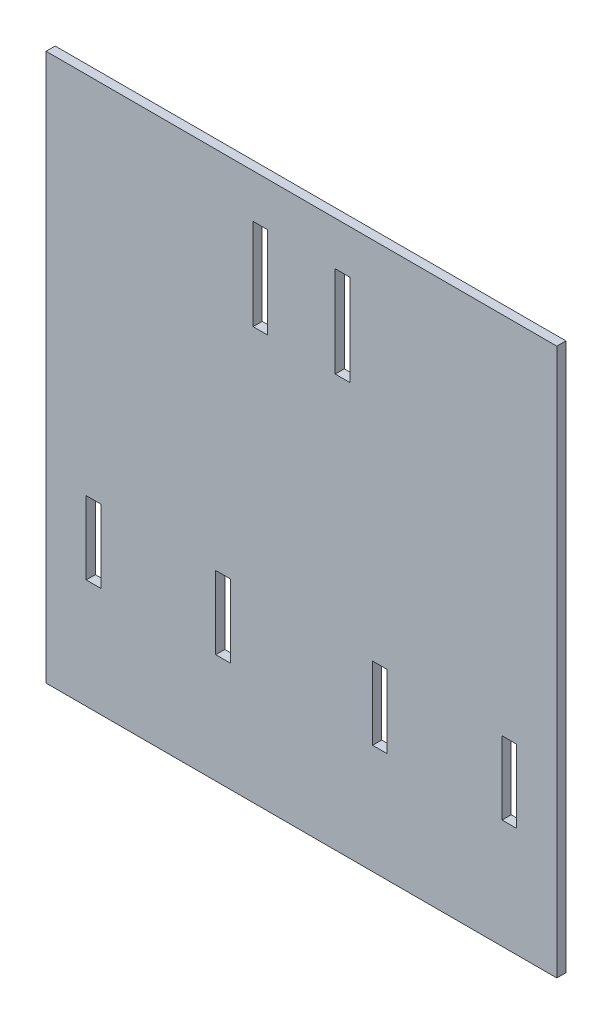
ISO-10303-21;
HEADER;
FILE_DESCRIPTION(('STEP AP214'),'2;1');
FILE_NAME('part.step','',(''),(''),'','','');
FILE_SCHEMA(('AUTOMOTIVE_DESIGN { 1 0 10303 214 1 1 1 1 }'));
ENDSEC;
DATA;
#1=APPLICATION_CONTEXT('core data for automotive mechanical design processes');
#2=APPLICATION_PROTOCOL_DEFINITION('international standard','automotive_design',2000,#1);
#3=PRODUCT_CONTEXT('',#1,'mechanical');
#4=PRODUCT('Part','Part','',(#3));
#5=PRODUCT_RELATED_PRODUCT_CATEGORY('part','',(#4));
#6=PRODUCT_DEFINITION_FORMATION('','',#4);
#7=PRODUCT_DEFINITION_CONTEXT('part definition',#1,'design');
#8=PRODUCT_DEFINITION('design','',#6,#7);
#9=PRODUCT_DEFINITION_SHAPE('','',#8);
#10=(LENGTH_UNIT() NAMED_UNIT(*) SI_UNIT(.MILLI.,.METRE.));
#11=(NAMED_UNIT(*) PLANE_ANGLE_UNIT() SI_UNIT($,.RADIAN.));
#12=(NAMED_UNIT(*) SI_UNIT($,.STERADIAN.) SOLID_ANGLE_UNIT());
#13=UNCERTAINTY_MEASURE_WITH_UNIT(LENGTH_MEASURE(1.E-05),#10,'distance_accuracy_value','');
#14=(GEOMETRIC_REPRESENTATION_CONTEXT(3) GLOBAL_UNCERTAINTY_ASSIGNED_CONTEXT((#13)) GLOBAL_UNIT_ASSIGNED_CONTEXT((#10,
#11,#12)) REPRESENTATION_CONTEXT('',''));
#15=CARTESIAN_POINT('',(0.,0.,0.));
#16=DIRECTION('',(0.,0.,1.));
#17=DIRECTION('',(1.,0.,0.));
#18=AXIS2_PLACEMENT_3D('',#15,#16,#17);
#19=CARTESIAN_POINT('',(-140.,0.,5.));
#20=DIRECTION('',(1.,0.,0.));
#21=DIRECTION('',(0.,0.,-1.));
#22=AXIS2_PLACEMENT_3D('',#19,#20,#21);
#23=PLANE('',#22);
#24=DIRECTION('',(0.,-1.,0.));
#25=VECTOR('',#24,1.);
#26=CARTESIAN_POINT('',(-140.,0.,0.));
#27=LINE('',#26,#25);
#28=CARTESIAN_POINT('',(-140.,300.,0.));
#29=VERTEX_POINT('',#28);
#30=CARTESIAN_POINT('',(-140.,0.,0.));
#31=VERTEX_POINT('',#30);
#32=EDGE_CURVE('E272',#29,#31,#27,.T.);
#33=ORIENTED_EDGE('',*,*,#32,.T.);
#34=DIRECTION('',(0.,0.,-1.));
#35=VECTOR('',#34,1.);
#36=CARTESIAN_POINT('',(-140.,0.,5.));
#37=LINE('',#36,#35);
#38=CARTESIAN_POINT('',(-140.,0.,5.));
#39=VERTEX_POINT('',#38);
#40=EDGE_CURVE('E11',#39,#31,#37,.T.);
#41=ORIENTED_EDGE('',*,*,#40,.F.);
#42=DIRECTION('',(0.,-1.,0.));
#43=VECTOR('',#42,1.);
#44=CARTESIAN_POINT('',(-140.,0.,5.));
#45=LINE('',#44,#43);
#46=CARTESIAN_POINT('',(-140.,300.,5.));
#47=VERTEX_POINT('',#46);
#48=EDGE_CURVE('E495',#47,#39,#45,.T.);
#49=ORIENTED_EDGE('',*,*,#48,.F.);
#50=DIRECTION('',(0.,0.,-1.));
#51=VECTOR('',#50,1.);
#52=CARTESIAN_POINT('',(-140.,300.,5.));
#53=LINE('',#52,#51);
#54=EDGE_CURVE('E509',#47,#29,#53,.T.);
#55=ORIENTED_EDGE('',*,*,#54,.T.);
#56=EDGE_LOOP('',(#33,#41,#49,#55));
#57=FACE_BOUND('',#56,.T.);
#58=ADVANCED_FACE('F39',(#57),#23,.F.);
#59=CARTESIAN_POINT('',(-140.,0.,5.));
#60=DIRECTION('',(0.,1.,0.));
#61=DIRECTION('',(0.,0.,1.));
#62=AXIS2_PLACEMENT_3D('',#59,#60,#61);
#63=PLANE('',#62);
#64=DIRECTION('',(1.,0.,0.));
#65=VECTOR('',#64,1.);
#66=CARTESIAN_POINT('',(-140.,0.,0.));
#67=LINE('',#66,#65);
#68=CARTESIAN_POINT('',(140.,0.,0.));
#69=VERTEX_POINT('',#68);
#70=EDGE_CURVE('E513',#31,#69,#67,.T.);
#71=ORIENTED_EDGE('',*,*,#70,.T.);
#72=DIRECTION('',(0.,0.,-1.));
#73=VECTOR('',#72,1.);
#74=CARTESIAN_POINT('',(140.,0.,5.));
#75=LINE('',#74,#73);
#76=CARTESIAN_POINT('',(140.,0.,5.));
#77=VERTEX_POINT('',#76);
#78=EDGE_CURVE('E47',#77,#69,#75,.T.);
#79=ORIENTED_EDGE('',*,*,#78,.F.);
#80=DIRECTION('',(1.,0.,0.));
#81=VECTOR('',#80,1.);
#82=CARTESIAN_POINT('',(-140.,0.,5.));
#83=LINE('',#82,#81);
#84=EDGE_CURVE('E499',#39,#77,#83,.T.);
#85=ORIENTED_EDGE('',*,*,#84,.F.);
#86=ORIENTED_EDGE('',*,*,#40,.T.);
#87=EDGE_LOOP('',(#71,#79,#85,#86));
#88=FACE_BOUND('',#87,.T.);
#89=ADVANCED_FACE('F548',(#88),#63,.F.);
#90=CARTESIAN_POINT('',(140.,0.,5.));
#91=DIRECTION('',(-1.,0.,0.));
#92=DIRECTION('',(0.,0.,1.));
#93=AXIS2_PLACEMENT_3D('',#90,#91,#92);
#94=PLANE('',#93);
#95=DIRECTION('',(0.,1.,0.));
#96=VECTOR('',#95,1.);
#97=CARTESIAN_POINT('',(140.,0.,0.));
#98=LINE('',#97,#96);
#99=CARTESIAN_POINT('',(140.,300.,0.));
#100=VERTEX_POINT('',#99);
#101=EDGE_CURVE('E516',#69,#100,#98,.T.);
#102=ORIENTED_EDGE('',*,*,#101,.T.);
#103=DIRECTION('',(0.,0.,-1.));
#104=VECTOR('',#103,1.);
#105=CARTESIAN_POINT('',(140.,300.,5.));
#106=LINE('',#105,#104);
#107=CARTESIAN_POINT('',(140.,300.,5.));
#108=VERTEX_POINT('',#107);
#109=EDGE_CURVE('E524',#108,#100,#106,.T.);
#110=ORIENTED_EDGE('',*,*,#109,.F.);
#111=DIRECTION('',(0.,1.,0.));
#112=VECTOR('',#111,1.);
#113=CARTESIAN_POINT('',(140.,0.,5.));
#114=LINE('',#113,#112);
#115=EDGE_CURVE('E503',#77,#108,#114,.T.);
#116=ORIENTED_EDGE('',*,*,#115,.F.);
#117=ORIENTED_EDGE('',*,*,#78,.T.);
#118=EDGE_LOOP('',(#102,#110,#116,#117));
#119=FACE_BOUND('',#118,.T.);
#120=ADVANCED_FACE('F533',(#119),#94,.F.);
#121=CARTESIAN_POINT('',(-140.,300.,5.));
#122=DIRECTION('',(0.,-1.,0.));
#123=DIRECTION('',(0.,0.,-1.));
#124=AXIS2_PLACEMENT_3D('',#121,#122,#123);
#125=PLANE('',#124);
#126=DIRECTION('',(-1.,0.,0.));
#127=VECTOR('',#126,1.);
#128=CARTESIAN_POINT('',(-140.,300.,0.));
#129=LINE('',#128,#127);
#130=EDGE_CURVE('E500',#100,#29,#129,.T.);
#131=ORIENTED_EDGE('',*,*,#130,.T.);
#132=ORIENTED_EDGE('',*,*,#54,.F.);
#133=DIRECTION('',(-1.,0.,0.));
#134=VECTOR('',#133,1.);
#135=CARTESIAN_POINT('',(-140.,300.,5.));
#136=LINE('',#135,#134);
#137=EDGE_CURVE('E506',#108,#47,#136,.T.);
#138=ORIENTED_EDGE('',*,*,#137,.F.);
#139=ORIENTED_EDGE('',*,*,#109,.T.);
#140=EDGE_LOOP('',(#131,#132,#138,#139));
#141=FACE_BOUND('',#140,.T.);
#142=ADVANCED_FACE('F542',(#141),#125,.F.);
#143=CARTESIAN_POINT('',(0.,0.,5.));
#144=DIRECTION('',(0.,0.,-1.));
#145=DIRECTION('',(-1.,0.,0.));
#146=AXIS2_PLACEMENT_3D('',#143,#144,#145);
#147=PLANE('',#146);
#148=DIRECTION('',(1.,0.,0.));
#149=VECTOR('',#148,1.);
#150=CARTESIAN_POINT('',(118.,100.,5.));
#151=LINE('',#150,#149);
#152=CARTESIAN_POINT('',(110.,100.,5.));
#153=VERTEX_POINT('',#152);
#154=CARTESIAN_POINT('',(118.,100.,5.));
#155=VERTEX_POINT('',#154);
#156=EDGE_CURVE('E237',#153,#155,#151,.T.);
#157=ORIENTED_EDGE('',*,*,#156,.T.);
#158=DIRECTION('',(0.,-1.,0.));
#159=VECTOR('',#158,1.);
#160=CARTESIAN_POINT('',(118.,100.,5.));
#161=LINE('',#160,#159);
#162=CARTESIAN_POINT('',(118.,60.,5.));
#163=VERTEX_POINT('',#162);
#164=EDGE_CURVE('E228',#155,#163,#161,.T.);
#165=ORIENTED_EDGE('',*,*,#164,.T.);
#166=DIRECTION('',(-1.,0.,0.));
#167=VECTOR('',#166,1.);
#168=CARTESIAN_POINT('',(118.,60.,5.));
#169=LINE('',#168,#167);
#170=CARTESIAN_POINT('',(110.,60.,5.));
#171=VERTEX_POINT('',#170);
#172=EDGE_CURVE('E240',#163,#171,#169,.T.);
#173=ORIENTED_EDGE('',*,*,#172,.T.);
#174=DIRECTION('',(0.,1.,0.));
#175=VECTOR('',#174,1.);
#176=CARTESIAN_POINT('',(110.,100.,5.));
#177=LINE('',#176,#175);
#178=EDGE_CURVE('E54',#171,#153,#177,.T.);
#179=ORIENTED_EDGE('',*,*,#178,.T.);
#180=EDGE_LOOP('',(#157,#165,#173,#179));
#181=FACE_BOUND('',#180,.T.);
#182=DIRECTION('',(1.,0.,0.));
#183=VECTOR('',#182,1.);
#184=CARTESIAN_POINT('',(-18.5,276.,5.));
#185=LINE('',#184,#183);
#186=CARTESIAN_POINT('',(-26.5,276.,5.));
#187=VERTEX_POINT('',#186);
#188=CARTESIAN_POINT('',(-18.5,276.,5.));
#189=VERTEX_POINT('',#188);
#190=EDGE_CURVE('E289',#187,#189,#185,.T.);
#191=ORIENTED_EDGE('',*,*,#190,.T.);
#192=DIRECTION('',(0.,-1.,0.));
#193=VECTOR('',#192,1.);
#194=CARTESIAN_POINT('',(-18.5,276.,5.));
#195=LINE('',#194,#193);
#196=CARTESIAN_POINT('',(-18.5,226.,5.));
#197=VERTEX_POINT('',#196);
#198=EDGE_CURVE('E278',#189,#197,#195,.T.);
#199=ORIENTED_EDGE('',*,*,#198,.T.);
#200=DIRECTION('',(-1.,0.,0.));
#201=VECTOR('',#200,1.);
#202=CARTESIAN_POINT('',(-18.5,226.,5.));
#203=LINE('',#202,#201);
#204=CARTESIAN_POINT('',(-26.5,226.,5.));
#205=VERTEX_POINT('',#204);
#206=EDGE_CURVE('E282',#197,#205,#203,.T.);
#207=ORIENTED_EDGE('',*,*,#206,.T.);
#208=DIRECTION('',(0.,1.,0.));
#209=VECTOR('',#208,1.);
#210=CARTESIAN_POINT('',(-26.5,276.,5.));
#211=LINE('',#210,#209);
#212=EDGE_CURVE('E62',#205,#187,#211,.T.);
#213=ORIENTED_EDGE('',*,*,#212,.T.);
#214=EDGE_LOOP('',(#191,#199,#207,#213));
#215=FACE_BOUND('',#214,.T.);
#216=DIRECTION('',(1.,0.,0.));
#217=VECTOR('',#216,1.);
#218=CARTESIAN_POINT('',(47.,100.,5.));
#219=LINE('',#218,#217);
#220=CARTESIAN_POINT('',(39.,100.,5.));
#221=VERTEX_POINT('',#220);
#222=CARTESIAN_POINT('',(47.,100.,5.));
#223=VERTEX_POINT('',#222);
#224=EDGE_CURVE('E422',#221,#223,#219,.T.);
#225=ORIENTED_EDGE('',*,*,#224,.T.);
#226=DIRECTION('',(0.,-1.,0.));
#227=VECTOR('',#226,1.);
#228=CARTESIAN_POINT('',(47.,100.,5.));
#229=LINE('',#228,#227);
#230=CARTESIAN_POINT('',(47.,60.,5.));
#231=VERTEX_POINT('',#230);
#232=EDGE_CURVE('E409',#223,#231,#229,.T.);
#233=ORIENTED_EDGE('',*,*,#232,.T.);
#234=DIRECTION('',(-1.,0.,0.));
#235=VECTOR('',#234,1.);
#236=CARTESIAN_POINT('',(47.,60.,5.));
#237=LINE('',#236,#235);
#238=CARTESIAN_POINT('',(39.,60.,5.));
#239=VERTEX_POINT('',#238);
#240=EDGE_CURVE('E413',#231,#239,#237,.T.);
#241=ORIENTED_EDGE('',*,*,#240,.T.);
#242=DIRECTION('',(0.,1.,0.));
#243=VECTOR('',#242,1.);
#244=CARTESIAN_POINT('',(39.,100.,5.));
#245=LINE('',#244,#243);
#246=EDGE_CURVE('E418',#239,#221,#245,.T.);
#247=ORIENTED_EDGE('',*,*,#246,.T.);
#248=EDGE_LOOP('',(#225,#233,#241,#247));
#249=FACE_BOUND('',#248,.T.);
#250=DIRECTION('',(1.,0.,0.));
#251=VECTOR('',#250,1.);
#252=CARTESIAN_POINT('',(-39.,100.,5.));
#253=LINE('',#252,#251);
#254=CARTESIAN_POINT('',(-47.,100.,5.));
#255=VERTEX_POINT('',#254);
#256=CARTESIAN_POINT('',(-39.,100.,5.));
#257=VERTEX_POINT('',#256);
#258=EDGE_CURVE('E466',#255,#257,#253,.T.);
#259=ORIENTED_EDGE('',*,*,#258,.T.);
#260=DIRECTION('',(0.,-1.,0.));
#261=VECTOR('',#260,1.);
#262=CARTESIAN_POINT('',(-39.,100.,5.));
#263=LINE('',#262,#261);
#264=CARTESIAN_POINT('',(-39.,60.,5.));
#265=VERTEX_POINT('',#264);
#266=EDGE_CURVE('E453',#257,#265,#263,.T.);
#267=ORIENTED_EDGE('',*,*,#266,.T.);
#268=DIRECTION('',(-1.,0.,0.));
#269=VECTOR('',#268,1.);
#270=CARTESIAN_POINT('',(-39.,60.,5.));
#271=LINE('',#270,#269);
#272=CARTESIAN_POINT('',(-47.,60.,5.));
#273=VERTEX_POINT('',#272);
#274=EDGE_CURVE('E457',#265,#273,#271,.T.);
#275=ORIENTED_EDGE('',*,*,#274,.T.);
#276=DIRECTION('',(0.,1.,0.));
#277=VECTOR('',#276,1.);
#278=CARTESIAN_POINT('',(-47.,100.,5.));
#279=LINE('',#278,#277);
#280=EDGE_CURVE('E462',#273,#255,#279,.T.);
#281=ORIENTED_EDGE('',*,*,#280,.T.);
#282=EDGE_LOOP('',(#259,#267,#275,#281));
#283=FACE_BOUND('',#282,.T.);
#284=DIRECTION('',(1.,0.,0.));
#285=VECTOR('',#284,1.);
#286=CARTESIAN_POINT('',(-110.,100.,5.));
#287=LINE('',#286,#285);
#288=CARTESIAN_POINT('',(-118.,100.,5.));
#289=VERTEX_POINT('',#288);
#290=CARTESIAN_POINT('',(-110.,100.,5.));
#291=VERTEX_POINT('',#290);
#292=EDGE_CURVE('E334',#289,#291,#287,.T.);
#293=ORIENTED_EDGE('',*,*,#292,.T.);
#294=DIRECTION('',(0.,-1.,0.));
#295=VECTOR('',#294,1.);
#296=CARTESIAN_POINT('',(-110.,100.,5.));
#297=LINE('',#296,#295);
#298=CARTESIAN_POINT('',(-110.,60.,5.));
#299=VERTEX_POINT('',#298);
#300=EDGE_CURVE('E321',#291,#299,#297,.T.);
#301=ORIENTED_EDGE('',*,*,#300,.T.);
#302=DIRECTION('',(-1.,0.,0.));
#303=VECTOR('',#302,1.);
#304=CARTESIAN_POINT('',(-110.,60.,5.));
#305=LINE('',#304,#303);
#306=CARTESIAN_POINT('',(-118.,60.,5.));
#307=VERTEX_POINT('',#306);
#308=EDGE_CURVE('E325',#299,#307,#305,.T.);
#309=ORIENTED_EDGE('',*,*,#308,.T.);
#310=DIRECTION('',(0.,1.,0.));
#311=VECTOR('',#310,1.);
#312=CARTESIAN_POINT('',(-118.,100.,5.));
#313=LINE('',#312,#311);
#314=EDGE_CURVE('E330',#307,#289,#313,.T.);
#315=ORIENTED_EDGE('',*,*,#314,.T.);
#316=EDGE_LOOP('',(#293,#301,#309,#315));
#317=FACE_BOUND('',#316,.T.);
#318=DIRECTION('',(1.,0.,0.));
#319=VECTOR('',#318,1.);
#320=CARTESIAN_POINT('',(26.5,276.,5.));
#321=LINE('',#320,#319);
#322=CARTESIAN_POINT('',(18.5,276.,5.));
#323=VERTEX_POINT('',#322);
#324=CARTESIAN_POINT('',(26.5,276.,5.));
#325=VERTEX_POINT('',#324);
#326=EDGE_CURVE('E380',#323,#325,#321,.T.);
#327=ORIENTED_EDGE('',*,*,#326,.T.);
#328=DIRECTION('',(0.,-1.,0.));
#329=VECTOR('',#328,1.);
#330=CARTESIAN_POINT('',(26.5,276.,5.));
#331=LINE('',#330,#329);
#332=CARTESIAN_POINT('',(26.5,226.,5.));
#333=VERTEX_POINT('',#332);
#334=EDGE_CURVE('E367',#325,#333,#331,.T.);
#335=ORIENTED_EDGE('',*,*,#334,.T.);
#336=DIRECTION('',(-1.,0.,0.));
#337=VECTOR('',#336,1.);
#338=CARTESIAN_POINT('',(26.5,226.,5.));
#339=LINE('',#338,#337);
#340=CARTESIAN_POINT('',(18.5,226.,5.));
#341=VERTEX_POINT('',#340);
#342=EDGE_CURVE('E371',#333,#341,#339,.T.);
#343=ORIENTED_EDGE('',*,*,#342,.T.);
#344=DIRECTION('',(0.,1.,0.));
#345=VECTOR('',#344,1.);
#346=CARTESIAN_POINT('',(18.5,276.,5.));
#347=LINE('',#346,#345);
#348=EDGE_CURVE('E376',#341,#323,#347,.T.);
#349=ORIENTED_EDGE('',*,*,#348,.T.);
#350=EDGE_LOOP('',(#327,#335,#343,#349));
#351=FACE_BOUND('',#350,.T.);
#352=ORIENTED_EDGE('',*,*,#48,.T.);
#353=ORIENTED_EDGE('',*,*,#84,.T.);
#354=ORIENTED_EDGE('',*,*,#115,.T.);
#355=ORIENTED_EDGE('',*,*,#137,.T.);
#356=EDGE_LOOP('',(#352,#353,#354,#355));
#357=FACE_BOUND('',#356,.T.);
#358=ADVANCED_FACE('F245',(#181,#215,#249,#283,#317,#351,#357),#147,.F.);
#359=CARTESIAN_POINT('',(0.,0.,0.));
#360=DIRECTION('',(0.,0.,-1.));
#361=DIRECTION('',(-1.,0.,0.));
#362=AXIS2_PLACEMENT_3D('',#359,#360,#361);
#363=PLANE('',#362);
#364=DIRECTION('',(0.,-1.,0.));
#365=VECTOR('',#364,1.);
#366=CARTESIAN_POINT('',(118.,100.,0.));
#367=LINE('',#366,#365);
#368=CARTESIAN_POINT('',(118.,100.,0.));
#369=VERTEX_POINT('',#368);
#370=CARTESIAN_POINT('',(118.,60.,0.));
#371=VERTEX_POINT('',#370);
#372=EDGE_CURVE('E231',#369,#371,#367,.T.);
#373=ORIENTED_EDGE('',*,*,#372,.F.);
#374=DIRECTION('',(1.,0.,0.));
#375=VECTOR('',#374,1.);
#376=CARTESIAN_POINT('',(118.,100.,0.));
#377=LINE('',#376,#375);
#378=CARTESIAN_POINT('',(110.,100.,0.));
#379=VERTEX_POINT('',#378);
#380=EDGE_CURVE('E249',#379,#369,#377,.T.);
#381=ORIENTED_EDGE('',*,*,#380,.F.);
#382=DIRECTION('',(0.,1.,0.));
#383=VECTOR('',#382,1.);
#384=CARTESIAN_POINT('',(110.,100.,0.));
#385=LINE('',#384,#383);
#386=CARTESIAN_POINT('',(110.,60.,0.));
#387=VERTEX_POINT('',#386);
#388=EDGE_CURVE('E253',#387,#379,#385,.T.);
#389=ORIENTED_EDGE('',*,*,#388,.F.);
#390=DIRECTION('',(-1.,0.,0.));
#391=VECTOR('',#390,1.);
#392=CARTESIAN_POINT('',(118.,60.,0.));
#393=LINE('',#392,#391);
#394=EDGE_CURVE('E262',#371,#387,#393,.T.);
#395=ORIENTED_EDGE('',*,*,#394,.F.);
#396=EDGE_LOOP('',(#373,#381,#389,#395));
#397=FACE_BOUND('',#396,.T.);
#398=DIRECTION('',(0.,-1.,0.));
#399=VECTOR('',#398,1.);
#400=CARTESIAN_POINT('',(-18.5,276.,0.));
#401=LINE('',#400,#399);
#402=CARTESIAN_POINT('',(-18.5,276.,0.));
#403=VERTEX_POINT('',#402);
#404=CARTESIAN_POINT('',(-18.5,226.,0.));
#405=VERTEX_POINT('',#404);
#406=EDGE_CURVE('E294',#403,#405,#401,.T.);
#407=ORIENTED_EDGE('',*,*,#406,.F.);
#408=DIRECTION('',(1.,0.,0.));
#409=VECTOR('',#408,1.);
#410=CARTESIAN_POINT('',(-18.5,276.,0.));
#411=LINE('',#410,#409);
#412=CARTESIAN_POINT('',(-26.5,276.,0.));
#413=VERTEX_POINT('',#412);
#414=EDGE_CURVE('E283',#413,#403,#411,.T.);
#415=ORIENTED_EDGE('',*,*,#414,.F.);
#416=DIRECTION('',(0.,1.,0.));
#417=VECTOR('',#416,1.);
#418=CARTESIAN_POINT('',(-26.5,276.,0.));
#419=LINE('',#418,#417);
#420=CARTESIAN_POINT('',(-26.5,226.,0.));
#421=VERTEX_POINT('',#420);
#422=EDGE_CURVE('E301',#421,#413,#419,.T.);
#423=ORIENTED_EDGE('',*,*,#422,.F.);
#424=DIRECTION('',(-1.,0.,0.));
#425=VECTOR('',#424,1.);
#426=CARTESIAN_POINT('',(-18.5,226.,0.));
#427=LINE('',#426,#425);
#428=EDGE_CURVE('E297',#405,#421,#427,.T.);
#429=ORIENTED_EDGE('',*,*,#428,.F.);
#430=EDGE_LOOP('',(#407,#415,#423,#429));
#431=FACE_BOUND('',#430,.T.);
#432=DIRECTION('',(0.,-1.,0.));
#433=VECTOR('',#432,1.);
#434=CARTESIAN_POINT('',(47.,100.,0.));
#435=LINE('',#434,#433);
#436=CARTESIAN_POINT('',(47.,100.,0.));
#437=VERTEX_POINT('',#436);
#438=CARTESIAN_POINT('',(47.,60.,0.));
#439=VERTEX_POINT('',#438);
#440=EDGE_CURVE('E427',#437,#439,#435,.T.);
#441=ORIENTED_EDGE('',*,*,#440,.F.);
#442=DIRECTION('',(1.,0.,0.));
#443=VECTOR('',#442,1.);
#444=CARTESIAN_POINT('',(47.,100.,0.));
#445=LINE('',#444,#443);
#446=CARTESIAN_POINT('',(39.,100.,0.));
#447=VERTEX_POINT('',#446);
#448=EDGE_CURVE('E414',#447,#437,#445,.T.);
#449=ORIENTED_EDGE('',*,*,#448,.F.);
#450=DIRECTION('',(0.,1.,0.));
#451=VECTOR('',#450,1.);
#452=CARTESIAN_POINT('',(39.,100.,0.));
#453=LINE('',#452,#451);
#454=CARTESIAN_POINT('',(39.,60.,0.));
#455=VERTEX_POINT('',#454);
#456=EDGE_CURVE('E435',#455,#447,#453,.T.);
#457=ORIENTED_EDGE('',*,*,#456,.F.);
#458=DIRECTION('',(-1.,0.,0.));
#459=VECTOR('',#458,1.);
#460=CARTESIAN_POINT('',(47.,60.,0.));
#461=LINE('',#460,#459);
#462=EDGE_CURVE('E430',#439,#455,#461,.T.);
#463=ORIENTED_EDGE('',*,*,#462,.F.);
#464=EDGE_LOOP('',(#441,#449,#457,#463));
#465=FACE_BOUND('',#464,.T.);
#466=DIRECTION('',(0.,-1.,0.));
#467=VECTOR('',#466,1.);
#468=CARTESIAN_POINT('',(-39.,100.,0.));
#469=LINE('',#468,#467);
#470=CARTESIAN_POINT('',(-39.,100.,0.));
#471=VERTEX_POINT('',#470);
#472=CARTESIAN_POINT('',(-39.,60.,0.));
#473=VERTEX_POINT('',#472);
#474=EDGE_CURVE('E357',#471,#473,#469,.T.);
#475=ORIENTED_EDGE('',*,*,#474,.F.);
#476=DIRECTION('',(1.,0.,0.));
#477=VECTOR('',#476,1.);
#478=CARTESIAN_POINT('',(-39.,100.,0.));
#479=LINE('',#478,#477);
#480=CARTESIAN_POINT('',(-47.,100.,0.));
#481=VERTEX_POINT('',#480);
#482=EDGE_CURVE('E458',#481,#471,#479,.T.);
#483=ORIENTED_EDGE('',*,*,#482,.F.);
#484=DIRECTION('',(0.,1.,0.));
#485=VECTOR('',#484,1.);
#486=CARTESIAN_POINT('',(-47.,100.,0.));
#487=LINE('',#486,#485);
#488=CARTESIAN_POINT('',(-47.,60.,0.));
#489=VERTEX_POINT('',#488);
#490=EDGE_CURVE('E477',#489,#481,#487,.T.);
#491=ORIENTED_EDGE('',*,*,#490,.F.);
#492=DIRECTION('',(-1.,0.,0.));
#493=VECTOR('',#492,1.);
#494=CARTESIAN_POINT('',(-39.,60.,0.));
#495=LINE('',#494,#493);
#496=EDGE_CURVE('E473',#473,#489,#495,.T.);
#497=ORIENTED_EDGE('',*,*,#496,.F.);
#498=EDGE_LOOP('',(#475,#483,#491,#497));
#499=FACE_BOUND('',#498,.T.);
#500=DIRECTION('',(0.,-1.,0.));
#501=VECTOR('',#500,1.);
#502=CARTESIAN_POINT('',(-110.,100.,0.));
#503=LINE('',#502,#501);
#504=CARTESIAN_POINT('',(-110.,100.,0.));
#505=VERTEX_POINT('',#504);
#506=CARTESIAN_POINT('',(-110.,60.,0.));
#507=VERTEX_POINT('',#506);
#508=EDGE_CURVE('E339',#505,#507,#503,.T.);
#509=ORIENTED_EDGE('',*,*,#508,.F.);
#510=DIRECTION('',(1.,0.,0.));
#511=VECTOR('',#510,1.);
#512=CARTESIAN_POINT('',(-110.,100.,0.));
#513=LINE('',#512,#511);
#514=CARTESIAN_POINT('',(-118.,100.,0.));
#515=VERTEX_POINT('',#514);
#516=EDGE_CURVE('E326',#515,#505,#513,.T.);
#517=ORIENTED_EDGE('',*,*,#516,.F.);
#518=DIRECTION('',(0.,1.,0.));
#519=VECTOR('',#518,1.);
#520=CARTESIAN_POINT('',(-118.,100.,0.));
#521=LINE('',#520,#519);
#522=CARTESIAN_POINT('',(-118.,60.,0.));
#523=VERTEX_POINT('',#522);
#524=EDGE_CURVE('E347',#523,#515,#521,.T.);
#525=ORIENTED_EDGE('',*,*,#524,.F.);
#526=DIRECTION('',(-1.,0.,0.));
#527=VECTOR('',#526,1.);
#528=CARTESIAN_POINT('',(-110.,60.,0.));
#529=LINE('',#528,#527);
#530=EDGE_CURVE('E342',#507,#523,#529,.T.);
#531=ORIENTED_EDGE('',*,*,#530,.F.);
#532=EDGE_LOOP('',(#509,#517,#525,#531));
#533=FACE_BOUND('',#532,.T.);
#534=DIRECTION('',(0.,-1.,0.));
#535=VECTOR('',#534,1.);
#536=CARTESIAN_POINT('',(26.5,276.,0.));
#537=LINE('',#536,#535);
#538=CARTESIAN_POINT('',(26.5,276.,0.));
#539=VERTEX_POINT('',#538);
#540=CARTESIAN_POINT('',(26.5,226.,0.));
#541=VERTEX_POINT('',#540);
#542=EDGE_CURVE('E311',#539,#541,#537,.T.);
#543=ORIENTED_EDGE('',*,*,#542,.F.);
#544=DIRECTION('',(1.,0.,0.));
#545=VECTOR('',#544,1.);
#546=CARTESIAN_POINT('',(26.5,276.,0.));
#547=LINE('',#546,#545);
#548=CARTESIAN_POINT('',(18.5,276.,0.));
#549=VERTEX_POINT('',#548);
#550=EDGE_CURVE('E372',#549,#539,#547,.T.);
#551=ORIENTED_EDGE('',*,*,#550,.F.);
#552=DIRECTION('',(0.,1.,0.));
#553=VECTOR('',#552,1.);
#554=CARTESIAN_POINT('',(18.5,276.,0.));
#555=LINE('',#554,#553);
#556=CARTESIAN_POINT('',(18.5,226.,0.));
#557=VERTEX_POINT('',#556);
#558=EDGE_CURVE('E391',#557,#549,#555,.T.);
#559=ORIENTED_EDGE('',*,*,#558,.F.);
#560=DIRECTION('',(-1.,0.,0.));
#561=VECTOR('',#560,1.);
#562=CARTESIAN_POINT('',(26.5,226.,0.));
#563=LINE('',#562,#561);
#564=EDGE_CURVE('E387',#541,#557,#563,.T.);
#565=ORIENTED_EDGE('',*,*,#564,.F.);
#566=EDGE_LOOP('',(#543,#551,#559,#565));
#567=FACE_BOUND('',#566,.T.);
#568=ORIENTED_EDGE('',*,*,#32,.F.);
#569=ORIENTED_EDGE('',*,*,#130,.F.);
#570=ORIENTED_EDGE('',*,*,#101,.F.);
#571=ORIENTED_EDGE('',*,*,#70,.F.);
#572=EDGE_LOOP('',(#568,#569,#570,#571));
#573=FACE_BOUND('',#572,.T.);
#574=ADVANCED_FACE('F539',(#397,#431,#465,#499,#533,#567,#573),#363,.T.);
#575=CARTESIAN_POINT('',(26.5,276.,5.));
#576=DIRECTION('',(1.,0.,0.));
#577=DIRECTION('',(0.,0.,-1.));
#578=AXIS2_PLACEMENT_3D('',#575,#576,#577);
#579=PLANE('',#578);
#580=ORIENTED_EDGE('',*,*,#542,.T.);
#581=DIRECTION('',(0.,0.,-1.));
#582=VECTOR('',#581,1.);
#583=CARTESIAN_POINT('',(26.5,226.,5.));
#584=LINE('',#583,#582);
#585=EDGE_CURVE('E384',#333,#541,#584,.T.);
#586=ORIENTED_EDGE('',*,*,#585,.F.);
#587=ORIENTED_EDGE('',*,*,#334,.F.);
#588=DIRECTION('',(0.,0.,-1.));
#589=VECTOR('',#588,1.);
#590=CARTESIAN_POINT('',(26.5,276.,5.));
#591=LINE('',#590,#589);
#592=EDGE_CURVE('E343',#325,#539,#591,.T.);
#593=ORIENTED_EDGE('',*,*,#592,.T.);
#594=EDGE_LOOP('',(#580,#586,#587,#593));
#595=FACE_BOUND('',#594,.T.);
#596=ADVANCED_FACE('F560',(#595),#579,.F.);
#597=CARTESIAN_POINT('',(26.5,276.,5.));
#598=DIRECTION('',(0.,1.,0.));
#599=DIRECTION('',(0.,0.,1.));
#600=AXIS2_PLACEMENT_3D('',#597,#598,#599);
#601=PLANE('',#600);
#602=ORIENTED_EDGE('',*,*,#550,.T.);
#603=ORIENTED_EDGE('',*,*,#592,.F.);
#604=ORIENTED_EDGE('',*,*,#326,.F.);
#605=DIRECTION('',(0.,0.,-1.));
#606=VECTOR('',#605,1.);
#607=CARTESIAN_POINT('',(18.5,276.,5.));
#608=LINE('',#607,#606);
#609=EDGE_CURVE('E400',#323,#549,#608,.T.);
#610=ORIENTED_EDGE('',*,*,#609,.T.);
#611=EDGE_LOOP('',(#602,#603,#604,#610));
#612=FACE_BOUND('',#611,.T.);
#613=ADVANCED_FACE('F600',(#612),#601,.F.);
#614=CARTESIAN_POINT('',(18.5,276.,5.));
#615=DIRECTION('',(-1.,0.,0.));
#616=DIRECTION('',(0.,0.,1.));
#617=AXIS2_PLACEMENT_3D('',#614,#615,#616);
#618=PLANE('',#617);
#619=ORIENTED_EDGE('',*,*,#558,.T.);
#620=ORIENTED_EDGE('',*,*,#609,.F.);
#621=ORIENTED_EDGE('',*,*,#348,.F.);
#622=DIRECTION('',(0.,0.,-1.));
#623=VECTOR('',#622,1.);
#624=CARTESIAN_POINT('',(18.5,226.,5.));
#625=LINE('',#624,#623);
#626=EDGE_CURVE('E403',#341,#557,#625,.T.);
#627=ORIENTED_EDGE('',*,*,#626,.T.);
#628=EDGE_LOOP('',(#619,#620,#621,#627));
#629=FACE_BOUND('',#628,.T.);
#630=ADVANCED_FACE('F606',(#629),#618,.F.);
#631=CARTESIAN_POINT('',(26.5,226.,5.));
#632=DIRECTION('',(0.,-1.,0.));
#633=DIRECTION('',(1.,0.,0.));
#634=AXIS2_PLACEMENT_3D('',#631,#632,#633);
#635=PLANE('',#634);
#636=ORIENTED_EDGE('',*,*,#564,.T.);
#637=ORIENTED_EDGE('',*,*,#626,.F.);
#638=ORIENTED_EDGE('',*,*,#342,.F.);
#639=ORIENTED_EDGE('',*,*,#585,.T.);
#640=EDGE_LOOP('',(#636,#637,#638,#639));
#641=FACE_BOUND('',#640,.T.);
#642=ADVANCED_FACE('F602',(#641),#635,.F.);
#643=CARTESIAN_POINT('',(-110.,100.,5.));
#644=DIRECTION('',(1.,0.,0.));
#645=DIRECTION('',(0.,0.,-1.));
#646=AXIS2_PLACEMENT_3D('',#643,#644,#645);
#647=PLANE('',#646);
#648=ORIENTED_EDGE('',*,*,#508,.T.);
#649=DIRECTION('',(0.,0.,-1.));
#650=VECTOR('',#649,1.);
#651=CARTESIAN_POINT('',(-110.,60.,5.));
#652=LINE('',#651,#650);
#653=EDGE_CURVE('E338',#299,#507,#652,.T.);
#654=ORIENTED_EDGE('',*,*,#653,.F.);
#655=ORIENTED_EDGE('',*,*,#300,.F.);
#656=DIRECTION('',(0.,0.,-1.));
#657=VECTOR('',#656,1.);
#658=CARTESIAN_POINT('',(-110.,100.,5.));
#659=LINE('',#658,#657);
#660=EDGE_CURVE('E354',#291,#505,#659,.T.);
#661=ORIENTED_EDGE('',*,*,#660,.T.);
#662=EDGE_LOOP('',(#648,#654,#655,#661));
#663=FACE_BOUND('',#662,.T.);
#664=ADVANCED_FACE('F605',(#663),#647,.F.);
#665=CARTESIAN_POINT('',(-110.,100.,5.));
#666=DIRECTION('',(0.,1.,0.));
#667=DIRECTION('',(-1.,0.,0.));
#668=AXIS2_PLACEMENT_3D('',#665,#666,#667);
#669=PLANE('',#668);
#670=ORIENTED_EDGE('',*,*,#516,.T.);
#671=ORIENTED_EDGE('',*,*,#660,.F.);
#672=ORIENTED_EDGE('',*,*,#292,.F.);
#673=DIRECTION('',(0.,0.,-1.));
#674=VECTOR('',#673,1.);
#675=CARTESIAN_POINT('',(-118.,100.,5.));
#676=LINE('',#675,#674);
#677=EDGE_CURVE('E358',#289,#515,#676,.T.);
#678=ORIENTED_EDGE('',*,*,#677,.T.);
#679=EDGE_LOOP('',(#670,#671,#672,#678));
#680=FACE_BOUND('',#679,.T.);
#681=ADVANCED_FACE('F616',(#680),#669,.F.);
#682=CARTESIAN_POINT('',(-118.,100.,5.));
#683=DIRECTION('',(-1.,0.,0.));
#684=DIRECTION('',(0.,-1.,0.));
#685=AXIS2_PLACEMENT_3D('',#682,#683,#684);
#686=PLANE('',#685);
#687=ORIENTED_EDGE('',*,*,#524,.T.);
#688=ORIENTED_EDGE('',*,*,#677,.F.);
#689=ORIENTED_EDGE('',*,*,#314,.F.);
#690=DIRECTION('',(0.,0.,-1.));
#691=VECTOR('',#690,1.);
#692=CARTESIAN_POINT('',(-118.,60.,5.));
#693=LINE('',#692,#691);
#694=EDGE_CURVE('E361',#307,#523,#693,.T.);
#695=ORIENTED_EDGE('',*,*,#694,.T.);
#696=EDGE_LOOP('',(#687,#688,#689,#695));
#697=FACE_BOUND('',#696,.T.);
#698=ADVANCED_FACE('F620',(#697),#686,.F.);
#699=CARTESIAN_POINT('',(-110.,60.,5.));
#700=DIRECTION('',(0.,-1.,0.));
#701=DIRECTION('',(0.,0.,-1.));
#702=AXIS2_PLACEMENT_3D('',#699,#700,#701);
#703=PLANE('',#702);
#704=ORIENTED_EDGE('',*,*,#530,.T.);
#705=ORIENTED_EDGE('',*,*,#694,.F.);
#706=ORIENTED_EDGE('',*,*,#308,.F.);
#707=ORIENTED_EDGE('',*,*,#653,.T.);
#708=EDGE_LOOP('',(#704,#705,#706,#707));
#709=FACE_BOUND('',#708,.T.);
#710=ADVANCED_FACE('F568',(#709),#703,.F.);
#711=CARTESIAN_POINT('',(-39.,100.,5.));
#712=DIRECTION('',(1.,0.,0.));
#713=DIRECTION('',(0.,0.,-1.));
#714=AXIS2_PLACEMENT_3D('',#711,#712,#713);
#715=PLANE('',#714);
#716=ORIENTED_EDGE('',*,*,#474,.T.);
#717=DIRECTION('',(0.,0.,-1.));
#718=VECTOR('',#717,1.);
#719=CARTESIAN_POINT('',(-39.,60.,5.));
#720=LINE('',#719,#718);
#721=EDGE_CURVE('E470',#265,#473,#720,.T.);
#722=ORIENTED_EDGE('',*,*,#721,.F.);
#723=ORIENTED_EDGE('',*,*,#266,.F.);
#724=DIRECTION('',(0.,0.,-1.));
#725=VECTOR('',#724,1.);
#726=CARTESIAN_POINT('',(-39.,100.,5.));
#727=LINE('',#726,#725);
#728=EDGE_CURVE('E431',#257,#471,#727,.T.);
#729=ORIENTED_EDGE('',*,*,#728,.T.);
#730=EDGE_LOOP('',(#716,#722,#723,#729));
#731=FACE_BOUND('',#730,.T.);
#732=ADVANCED_FACE('F564',(#731),#715,.F.);
#733=CARTESIAN_POINT('',(-39.,100.,5.));
#734=DIRECTION('',(0.,1.,0.));
#735=DIRECTION('',(0.,0.,1.));
#736=AXIS2_PLACEMENT_3D('',#733,#734,#735);
#737=PLANE('',#736);
#738=ORIENTED_EDGE('',*,*,#482,.T.);
#739=ORIENTED_EDGE('',*,*,#728,.F.);
#740=ORIENTED_EDGE('',*,*,#258,.F.);
#741=DIRECTION('',(0.,0.,-1.));
#742=VECTOR('',#741,1.);
#743=CARTESIAN_POINT('',(-47.,100.,5.));
#744=LINE('',#743,#742);
#745=EDGE_CURVE('E486',#255,#481,#744,.T.);
#746=ORIENTED_EDGE('',*,*,#745,.T.);
#747=EDGE_LOOP('',(#738,#739,#740,#746));
#748=FACE_BOUND('',#747,.T.);
#749=ADVANCED_FACE('F567',(#748),#737,.F.);
#750=CARTESIAN_POINT('',(-47.,100.,5.));
#751=DIRECTION('',(-1.,0.,0.));
#752=DIRECTION('',(0.,0.,1.));
#753=AXIS2_PLACEMENT_3D('',#750,#751,#752);
#754=PLANE('',#753);
#755=ORIENTED_EDGE('',*,*,#490,.T.);
#756=ORIENTED_EDGE('',*,*,#745,.F.);
#757=ORIENTED_EDGE('',*,*,#280,.F.);
#758=DIRECTION('',(0.,0.,-1.));
#759=VECTOR('',#758,1.);
#760=CARTESIAN_POINT('',(-47.,60.,5.));
#761=LINE('',#760,#759);
#762=EDGE_CURVE('E489',#273,#489,#761,.T.);
#763=ORIENTED_EDGE('',*,*,#762,.T.);
#764=EDGE_LOOP('',(#755,#756,#757,#763));
#765=FACE_BOUND('',#764,.T.);
#766=ADVANCED_FACE('F574',(#765),#754,.F.);
#767=CARTESIAN_POINT('',(-39.,60.,5.));
#768=DIRECTION('',(0.,-1.,0.));
#769=DIRECTION('',(0.,0.,-1.));
#770=AXIS2_PLACEMENT_3D('',#767,#768,#769);
#771=PLANE('',#770);
#772=ORIENTED_EDGE('',*,*,#496,.T.);
#773=ORIENTED_EDGE('',*,*,#762,.F.);
#774=ORIENTED_EDGE('',*,*,#274,.F.);
#775=ORIENTED_EDGE('',*,*,#721,.T.);
#776=EDGE_LOOP('',(#772,#773,#774,#775));
#777=FACE_BOUND('',#776,.T.);
#778=ADVANCED_FACE('F570',(#777),#771,.F.);
#779=CARTESIAN_POINT('',(47.,100.,5.));
#780=DIRECTION('',(1.,0.,0.));
#781=DIRECTION('',(0.,1.,0.));
#782=AXIS2_PLACEMENT_3D('',#779,#780,#781);
#783=PLANE('',#782);
#784=ORIENTED_EDGE('',*,*,#440,.T.);
#785=DIRECTION('',(0.,0.,-1.));
#786=VECTOR('',#785,1.);
#787=CARTESIAN_POINT('',(47.,60.,5.));
#788=LINE('',#787,#786);
#789=EDGE_CURVE('E426',#231,#439,#788,.T.);
#790=ORIENTED_EDGE('',*,*,#789,.F.);
#791=ORIENTED_EDGE('',*,*,#232,.F.);
#792=DIRECTION('',(0.,0.,-1.));
#793=VECTOR('',#792,1.);
#794=CARTESIAN_POINT('',(47.,100.,5.));
#795=LINE('',#794,#793);
#796=EDGE_CURVE('E263',#223,#437,#795,.T.);
#797=ORIENTED_EDGE('',*,*,#796,.T.);
#798=EDGE_LOOP('',(#784,#790,#791,#797));
#799=FACE_BOUND('',#798,.T.);
#800=ADVANCED_FACE('F573',(#799),#783,.F.);
#801=CARTESIAN_POINT('',(47.,100.,5.));
#802=DIRECTION('',(0.,1.,0.));
#803=DIRECTION('',(-1.,0.,0.));
#804=AXIS2_PLACEMENT_3D('',#801,#802,#803);
#805=PLANE('',#804);
#806=ORIENTED_EDGE('',*,*,#448,.T.);
#807=ORIENTED_EDGE('',*,*,#796,.F.);
#808=ORIENTED_EDGE('',*,*,#224,.F.);
#809=DIRECTION('',(0.,0.,-1.));
#810=VECTOR('',#809,1.);
#811=CARTESIAN_POINT('',(39.,100.,5.));
#812=LINE('',#811,#810);
#813=EDGE_CURVE('E444',#221,#447,#812,.T.);
#814=ORIENTED_EDGE('',*,*,#813,.T.);
#815=EDGE_LOOP('',(#806,#807,#808,#814));
#816=FACE_BOUND('',#815,.T.);
#817=ADVANCED_FACE('F584',(#816),#805,.F.);
#818=CARTESIAN_POINT('',(39.,100.,5.));
#819=DIRECTION('',(-1.,0.,0.));
#820=DIRECTION('',(0.,0.,1.));
#821=AXIS2_PLACEMENT_3D('',#818,#819,#820);
#822=PLANE('',#821);
#823=ORIENTED_EDGE('',*,*,#456,.T.);
#824=ORIENTED_EDGE('',*,*,#813,.F.);
#825=ORIENTED_EDGE('',*,*,#246,.F.);
#826=DIRECTION('',(0.,0.,-1.));
#827=VECTOR('',#826,1.);
#828=CARTESIAN_POINT('',(39.,60.,5.));
#829=LINE('',#828,#827);
#830=EDGE_CURVE('E447',#239,#455,#829,.T.);
#831=ORIENTED_EDGE('',*,*,#830,.T.);
#832=EDGE_LOOP('',(#823,#824,#825,#831));
#833=FACE_BOUND('',#832,.T.);
#834=ADVANCED_FACE('F590',(#833),#822,.F.);
#835=CARTESIAN_POINT('',(47.,60.,5.));
#836=DIRECTION('',(0.,-1.,0.));
#837=DIRECTION('',(0.,0.,-1.));
#838=AXIS2_PLACEMENT_3D('',#835,#836,#837);
#839=PLANE('',#838);
#840=ORIENTED_EDGE('',*,*,#462,.T.);
#841=ORIENTED_EDGE('',*,*,#830,.F.);
#842=ORIENTED_EDGE('',*,*,#240,.F.);
#843=ORIENTED_EDGE('',*,*,#789,.T.);
#844=EDGE_LOOP('',(#840,#841,#842,#843));
#845=FACE_BOUND('',#844,.T.);
#846=ADVANCED_FACE('F586',(#845),#839,.F.);
#847=CARTESIAN_POINT('',(-18.5,276.,5.));
#848=DIRECTION('',(1.,0.,0.));
#849=DIRECTION('',(0.,1.,0.));
#850=AXIS2_PLACEMENT_3D('',#847,#848,#849);
#851=PLANE('',#850);
#852=ORIENTED_EDGE('',*,*,#406,.T.);
#853=DIRECTION('',(0.,0.,-1.));
#854=VECTOR('',#853,1.);
#855=CARTESIAN_POINT('',(-18.5,226.,5.));
#856=LINE('',#855,#854);
#857=EDGE_CURVE('E293',#197,#405,#856,.T.);
#858=ORIENTED_EDGE('',*,*,#857,.F.);
#859=ORIENTED_EDGE('',*,*,#198,.F.);
#860=DIRECTION('',(0.,0.,-1.));
#861=VECTOR('',#860,1.);
#862=CARTESIAN_POINT('',(-18.5,276.,5.));
#863=LINE('',#862,#861);
#864=EDGE_CURVE('E308',#189,#403,#863,.T.);
#865=ORIENTED_EDGE('',*,*,#864,.T.);
#866=EDGE_LOOP('',(#852,#858,#859,#865));
#867=FACE_BOUND('',#866,.T.);
#868=ADVANCED_FACE('F589',(#867),#851,.F.);
#869=CARTESIAN_POINT('',(-18.5,276.,5.));
#870=DIRECTION('',(0.,1.,0.));
#871=DIRECTION('',(0.,0.,1.));
#872=AXIS2_PLACEMENT_3D('',#869,#870,#871);
#873=PLANE('',#872);
#874=ORIENTED_EDGE('',*,*,#414,.T.);
#875=ORIENTED_EDGE('',*,*,#864,.F.);
#876=ORIENTED_EDGE('',*,*,#190,.F.);
#877=DIRECTION('',(0.,0.,-1.));
#878=VECTOR('',#877,1.);
#879=CARTESIAN_POINT('',(-26.5,276.,5.));
#880=LINE('',#879,#878);
#881=EDGE_CURVE('E312',#187,#413,#880,.T.);
#882=ORIENTED_EDGE('',*,*,#881,.T.);
#883=EDGE_LOOP('',(#874,#875,#876,#882));
#884=FACE_BOUND('',#883,.T.);
#885=ADVANCED_FACE('F630',(#884),#873,.F.);
#886=CARTESIAN_POINT('',(-26.5,276.,5.));
#887=DIRECTION('',(-1.,0.,0.));
#888=DIRECTION('',(0.,-1.,0.));
#889=AXIS2_PLACEMENT_3D('',#886,#887,#888);
#890=PLANE('',#889);
#891=ORIENTED_EDGE('',*,*,#422,.T.);
#892=ORIENTED_EDGE('',*,*,#881,.F.);
#893=ORIENTED_EDGE('',*,*,#212,.F.);
#894=DIRECTION('',(0.,0.,-1.));
#895=VECTOR('',#894,1.);
#896=CARTESIAN_POINT('',(-26.5,226.,5.));
#897=LINE('',#896,#895);
#898=EDGE_CURVE('E315',#205,#421,#897,.T.);
#899=ORIENTED_EDGE('',*,*,#898,.T.);
#900=EDGE_LOOP('',(#891,#892,#893,#899));
#901=FACE_BOUND('',#900,.T.);
#902=ADVANCED_FACE('F635',(#901),#890,.F.);
#903=CARTESIAN_POINT('',(-18.5,226.,5.));
#904=DIRECTION('',(0.,-1.,0.));
#905=DIRECTION('',(0.,0.,-1.));
#906=AXIS2_PLACEMENT_3D('',#903,#904,#905);
#907=PLANE('',#906);
#908=ORIENTED_EDGE('',*,*,#428,.T.);
#909=ORIENTED_EDGE('',*,*,#898,.F.);
#910=ORIENTED_EDGE('',*,*,#206,.F.);
#911=ORIENTED_EDGE('',*,*,#857,.T.);
#912=EDGE_LOOP('',(#908,#909,#910,#911));
#913=FACE_BOUND('',#912,.T.);
#914=ADVANCED_FACE('F632',(#913),#907,.F.);
#915=CARTESIAN_POINT('',(118.,100.,5.));
#916=DIRECTION('',(1.,0.,0.));
#917=DIRECTION('',(0.,0.,-1.));
#918=AXIS2_PLACEMENT_3D('',#915,#916,#917);
#919=PLANE('',#918);
#920=ORIENTED_EDGE('',*,*,#372,.T.);
#921=DIRECTION('',(0.,0.,-1.));
#922=VECTOR('',#921,1.);
#923=CARTESIAN_POINT('',(118.,60.,5.));
#924=LINE('',#923,#922);
#925=EDGE_CURVE('E224',#163,#371,#924,.T.);
#926=ORIENTED_EDGE('',*,*,#925,.F.);
#927=ORIENTED_EDGE('',*,*,#164,.F.);
#928=DIRECTION('',(0.,0.,-1.));
#929=VECTOR('',#928,1.);
#930=CARTESIAN_POINT('',(118.,100.,5.));
#931=LINE('',#930,#929);
#932=EDGE_CURVE('E269',#155,#369,#931,.T.);
#933=ORIENTED_EDGE('',*,*,#932,.T.);
#934=EDGE_LOOP('',(#920,#926,#927,#933));
#935=FACE_BOUND('',#934,.T.);
#936=ADVANCED_FACE('F226',(#935),#919,.F.);
#937=CARTESIAN_POINT('',(118.,100.,5.));
#938=DIRECTION('',(0.,1.,0.));
#939=DIRECTION('',(0.,0.,1.));
#940=AXIS2_PLACEMENT_3D('',#937,#938,#939);
#941=PLANE('',#940);
#942=ORIENTED_EDGE('',*,*,#380,.T.);
#943=ORIENTED_EDGE('',*,*,#932,.F.);
#944=ORIENTED_EDGE('',*,*,#156,.F.);
#945=DIRECTION('',(0.,0.,-1.));
#946=VECTOR('',#945,1.);
#947=CARTESIAN_POINT('',(110.,100.,5.));
#948=LINE('',#947,#946);
#949=EDGE_CURVE('E273',#153,#379,#948,.T.);
#950=ORIENTED_EDGE('',*,*,#949,.T.);
#951=EDGE_LOOP('',(#942,#943,#944,#950));
#952=FACE_BOUND('',#951,.T.);
#953=ADVANCED_FACE('F644',(#952),#941,.F.);
#954=CARTESIAN_POINT('',(110.,100.,5.));
#955=DIRECTION('',(-1.,0.,0.));
#956=DIRECTION('',(0.,-1.,0.));
#957=AXIS2_PLACEMENT_3D('',#954,#955,#956);
#958=PLANE('',#957);
#959=ORIENTED_EDGE('',*,*,#388,.T.);
#960=ORIENTED_EDGE('',*,*,#949,.F.);
#961=ORIENTED_EDGE('',*,*,#178,.F.);
#962=DIRECTION('',(0.,0.,-1.));
#963=VECTOR('',#962,1.);
#964=CARTESIAN_POINT('',(110.,60.,5.));
#965=LINE('',#964,#963);
#966=EDGE_CURVE('E236',#171,#387,#965,.T.);
#967=ORIENTED_EDGE('',*,*,#966,.T.);
#968=EDGE_LOOP('',(#959,#960,#961,#967));
#969=FACE_BOUND('',#968,.T.);
#970=ADVANCED_FACE('F647',(#969),#958,.F.);
#971=CARTESIAN_POINT('',(118.,60.,5.));
#972=DIRECTION('',(0.,-1.,0.));
#973=DIRECTION('',(0.,0.,-1.));
#974=AXIS2_PLACEMENT_3D('',#971,#972,#973);
#975=PLANE('',#974);
#976=ORIENTED_EDGE('',*,*,#394,.T.);
#977=ORIENTED_EDGE('',*,*,#966,.F.);
#978=ORIENTED_EDGE('',*,*,#172,.F.);
#979=ORIENTED_EDGE('',*,*,#925,.T.);
#980=EDGE_LOOP('',(#976,#977,#978,#979));
#981=FACE_BOUND('',#980,.T.);
#982=ADVANCED_FACE('F241',(#981),#975,.F.);
#983=CLOSED_SHELL('',(#58,#89,#120,#142,#358,#574,#596,#613,#630,#642,#664,#681,#698,#710,#732,
#749,#766,#778,#800,#817,#834,#846,#868,#885,#902,#914,#936,#953,#970,#982));
#984=MANIFOLD_SOLID_BREP('B2',#983);
#985=ADVANCED_BREP_SHAPE_REPRESENTATION('',(#18,#984),#14);
#986=SHAPE_DEFINITION_REPRESENTATION(#9,#985);
ENDSEC;
END-ISO-10303-21;
